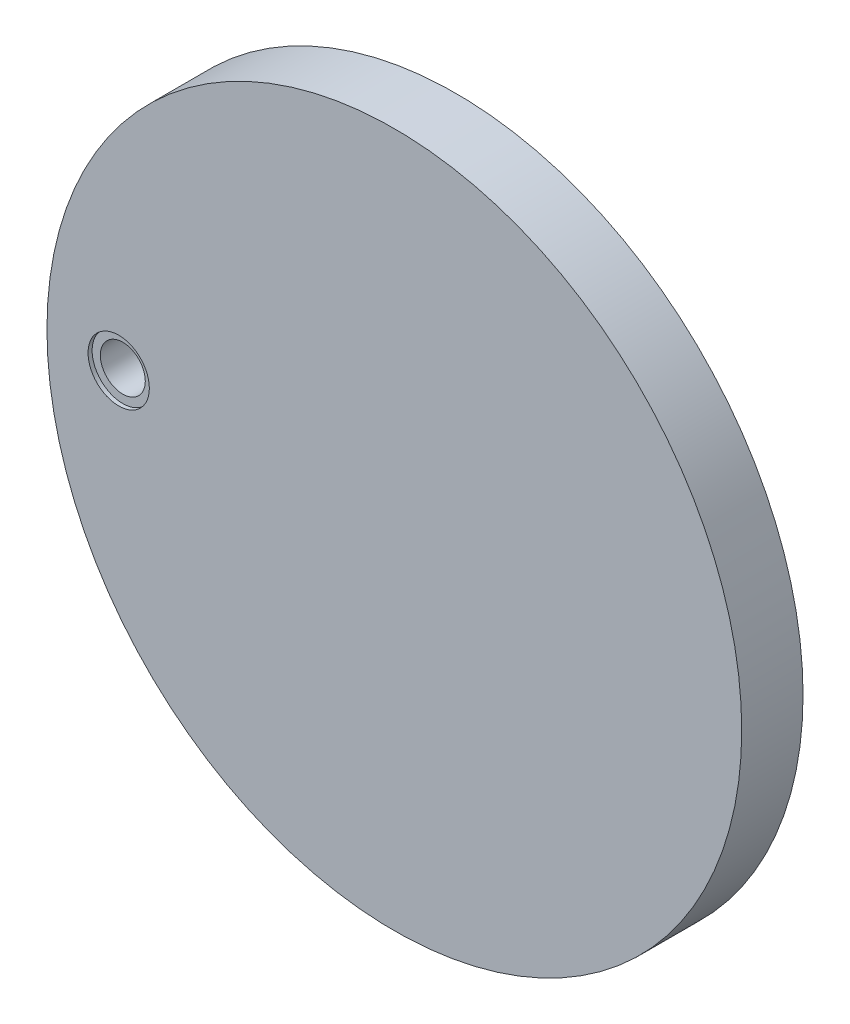
ISO-10303-21;
HEADER;
FILE_DESCRIPTION(('STEP AP214'),'2;1');
FILE_NAME('part.step','',(''),(''),'','','');
FILE_SCHEMA(('AUTOMOTIVE_DESIGN { 1 0 10303 214 1 1 1 1 }'));
ENDSEC;
DATA;
#1=APPLICATION_CONTEXT('core data for automotive mechanical design processes');
#2=APPLICATION_PROTOCOL_DEFINITION('international standard','automotive_design',2000,#1);
#3=PRODUCT_CONTEXT('',#1,'mechanical');
#4=PRODUCT('Part','Part','',(#3));
#5=PRODUCT_RELATED_PRODUCT_CATEGORY('part','',(#4));
#6=PRODUCT_DEFINITION_FORMATION('','',#4);
#7=PRODUCT_DEFINITION_CONTEXT('part definition',#1,'design');
#8=PRODUCT_DEFINITION('design','',#6,#7);
#9=PRODUCT_DEFINITION_SHAPE('','',#8);
#10=(LENGTH_UNIT() NAMED_UNIT(*) SI_UNIT(.MILLI.,.METRE.));
#11=(NAMED_UNIT(*) PLANE_ANGLE_UNIT() SI_UNIT($,.RADIAN.));
#12=(NAMED_UNIT(*) SI_UNIT($,.STERADIAN.) SOLID_ANGLE_UNIT());
#13=UNCERTAINTY_MEASURE_WITH_UNIT(LENGTH_MEASURE(1.E-05),#10,'distance_accuracy_value','');
#14=(GEOMETRIC_REPRESENTATION_CONTEXT(3) GLOBAL_UNCERTAINTY_ASSIGNED_CONTEXT((#13)) GLOBAL_UNIT_ASSIGNED_CONTEXT((#10,
#11,#12)) REPRESENTATION_CONTEXT('',''));
#15=CARTESIAN_POINT('',(0.,0.,0.));
#16=DIRECTION('',(0.,0.,1.));
#17=DIRECTION('',(1.,0.,0.));
#18=AXIS2_PLACEMENT_3D('',#15,#16,#17);
#19=CARTESIAN_POINT('',(-112.573673301342,0.,15.));
#20=DIRECTION('',(0.,0.,-1.));
#21=DIRECTION('',(-1.,0.,0.));
#22=AXIS2_PLACEMENT_3D('',#19,#20,#21);
#23=CYLINDRICAL_SURFACE('',#22,85.);
#24=CARTESIAN_POINT('',(-112.573673301342,0.,15.));
#25=DIRECTION('',(0.,0.,1.));
#26=DIRECTION('',(1.,0.,0.));
#27=AXIS2_PLACEMENT_3D('',#24,#25,#26);
#28=CIRCLE('',#27,85.);
#29=CARTESIAN_POINT('',(-27.5736733013416,0.,15.));
#30=VERTEX_POINT('',#29);
#31=EDGE_CURVE('E10',#30,#30,#28,.T.);
#32=ORIENTED_EDGE('',*,*,#31,.F.);
#33=EDGE_LOOP('',(#32));
#34=FACE_BOUND('',#33,.T.);
#35=CARTESIAN_POINT('',(-112.573673301342,0.,0.));
#36=DIRECTION('',(0.,0.,1.));
#37=DIRECTION('',(1.,0.,0.));
#38=AXIS2_PLACEMENT_3D('',#35,#36,#37);
#39=CIRCLE('',#38,85.);
#40=CARTESIAN_POINT('',(-27.5736733013416,0.,0.));
#41=VERTEX_POINT('',#40);
#42=EDGE_CURVE('E33',#41,#41,#39,.T.);
#43=ORIENTED_EDGE('',*,*,#42,.T.);
#44=EDGE_LOOP('',(#43));
#45=FACE_BOUND('',#44,.T.);
#46=ADVANCED_FACE('F30',(#34,#45),#23,.T.);
#47=CARTESIAN_POINT('',(-112.573673301342,0.,15.));
#48=DIRECTION('',(0.,0.,1.));
#49=DIRECTION('',(1.,0.,0.));
#50=AXIS2_PLACEMENT_3D('',#47,#48,#49);
#51=PLANE('',#50);
#52=CARTESIAN_POINT('',(-180.019561977106,0.,15.));
#53=DIRECTION('',(0.,0.,1.));
#54=DIRECTION('',(1.,0.,0.));
#55=AXIS2_PLACEMENT_3D('',#52,#53,#54);
#56=CIRCLE('',#55,7.50000000000001);
#57=CARTESIAN_POINT('',(-172.519561977106,0.,15.));
#58=VERTEX_POINT('',#57);
#59=EDGE_CURVE('E42',#58,#58,#56,.T.);
#60=ORIENTED_EDGE('',*,*,#59,.F.);
#61=EDGE_LOOP('',(#60));
#62=FACE_BOUND('',#61,.T.);
#63=ORIENTED_EDGE('',*,*,#31,.T.);
#64=EDGE_LOOP('',(#63));
#65=FACE_BOUND('',#64,.T.);
#66=ADVANCED_FACE('F70',(#62,#65),#51,.T.);
#67=CARTESIAN_POINT('',(-112.573673301342,0.,0.));
#68=DIRECTION('',(0.,0.,1.));
#69=DIRECTION('',(1.,0.,0.));
#70=AXIS2_PLACEMENT_3D('',#67,#68,#69);
#71=PLANE('',#70);
#72=CARTESIAN_POINT('',(-180.010590855629,0.,0.));
#73=DIRECTION('',(0.,0.,1.));
#74=DIRECTION('',(1.,0.,0.));
#75=AXIS2_PLACEMENT_3D('',#72,#73,#74);
#76=CIRCLE('',#75,5.50000000000002);
#77=CARTESIAN_POINT('',(-174.510590855629,0.,0.));
#78=VERTEX_POINT('',#77);
#79=EDGE_CURVE('E45',#78,#78,#76,.T.);
#80=ORIENTED_EDGE('',*,*,#79,.T.);
#81=EDGE_LOOP('',(#80));
#82=FACE_BOUND('',#81,.T.);
#83=ORIENTED_EDGE('',*,*,#42,.F.);
#84=EDGE_LOOP('',(#83));
#85=FACE_BOUND('',#84,.T.);
#86=ADVANCED_FACE('F66',(#82,#85),#71,.F.);
#87=CARTESIAN_POINT('',(-180.019561977106,0.,14.));
#88=DIRECTION('',(0.,0.,1.));
#89=DIRECTION('',(1.,0.,0.));
#90=AXIS2_PLACEMENT_3D('',#87,#88,#89);
#91=CYLINDRICAL_SURFACE('',#90,7.50000000000001);
#92=CARTESIAN_POINT('',(-180.019561977106,0.,14.));
#93=DIRECTION('',(0.,0.,1.));
#94=DIRECTION('',(1.,0.,0.));
#95=AXIS2_PLACEMENT_3D('',#92,#93,#94);
#96=CIRCLE('',#95,7.50000000000001);
#97=CARTESIAN_POINT('',(-172.519561977106,0.,14.));
#98=VERTEX_POINT('',#97);
#99=EDGE_CURVE('E40',#98,#98,#96,.T.);
#100=ORIENTED_EDGE('',*,*,#99,.F.);
#101=EDGE_LOOP('',(#100));
#102=FACE_BOUND('',#101,.T.);
#103=ORIENTED_EDGE('',*,*,#59,.T.);
#104=EDGE_LOOP('',(#103));
#105=FACE_BOUND('',#104,.T.);
#106=ADVANCED_FACE('F60',(#102,#105),#91,.F.);
#107=CARTESIAN_POINT('',(-180.019561977106,0.,14.));
#108=DIRECTION('',(0.,0.,1.));
#109=DIRECTION('',(1.,0.,0.));
#110=AXIS2_PLACEMENT_3D('',#107,#108,#109);
#111=PLANE('',#110);
#112=CARTESIAN_POINT('',(-180.010590855629,0.,14.));
#113=DIRECTION('',(0.,0.,1.));
#114=DIRECTION('',(1.,0.,0.));
#115=AXIS2_PLACEMENT_3D('',#112,#113,#114);
#116=CIRCLE('',#115,5.50000000000002);
#117=CARTESIAN_POINT('',(-174.510590855629,0.,14.));
#118=VERTEX_POINT('',#117);
#119=EDGE_CURVE('E50',#118,#118,#116,.T.);
#120=ORIENTED_EDGE('',*,*,#119,.F.);
#121=EDGE_LOOP('',(#120));
#122=FACE_BOUND('',#121,.T.);
#123=ORIENTED_EDGE('',*,*,#99,.T.);
#124=EDGE_LOOP('',(#123));
#125=FACE_BOUND('',#124,.T.);
#126=ADVANCED_FACE('F57',(#122,#125),#111,.T.);
#127=CARTESIAN_POINT('',(-180.010590855629,0.,-1.));
#128=DIRECTION('',(0.,0.,1.));
#129=DIRECTION('',(1.,0.,0.));
#130=AXIS2_PLACEMENT_3D('',#127,#128,#129);
#131=CYLINDRICAL_SURFACE('',#130,5.50000000000002);
#132=ORIENTED_EDGE('',*,*,#119,.T.);
#133=EDGE_LOOP('',(#132));
#134=FACE_BOUND('',#133,.T.);
#135=ORIENTED_EDGE('',*,*,#79,.F.);
#136=EDGE_LOOP('',(#135));
#137=FACE_BOUND('',#136,.T.);
#138=ADVANCED_FACE('F54',(#134,#137),#131,.F.);
#139=CLOSED_SHELL('',(#46,#66,#86,#106,#126,#138));
#140=MANIFOLD_SOLID_BREP('B2',#139);
#141=ADVANCED_BREP_SHAPE_REPRESENTATION('',(#18,#140),#14);
#142=SHAPE_DEFINITION_REPRESENTATION(#9,#141);
ENDSEC;
END-ISO-10303-21;
